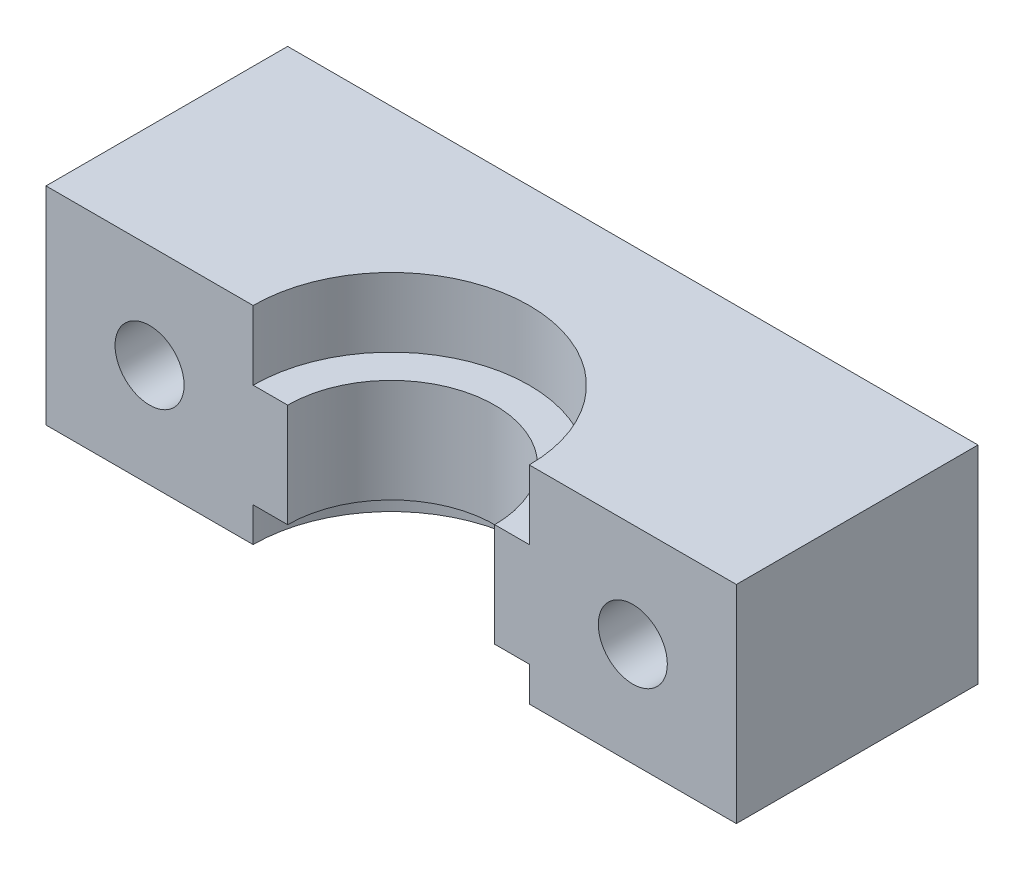
ISO-10303-21;
HEADER;
FILE_DESCRIPTION(('STEP AP214'),'2;1');
FILE_NAME('part.step','',(''),(''),'','','');
FILE_SCHEMA(('AUTOMOTIVE_DESIGN { 1 0 10303 214 1 1 1 1 }'));
ENDSEC;
DATA;
#1=APPLICATION_CONTEXT('core data for automotive mechanical design processes');
#2=APPLICATION_PROTOCOL_DEFINITION('international standard','automotive_design',2000,#1);
#3=PRODUCT_CONTEXT('',#1,'mechanical');
#4=PRODUCT('Part','Part','',(#3));
#5=PRODUCT_RELATED_PRODUCT_CATEGORY('part','',(#4));
#6=PRODUCT_DEFINITION_FORMATION('','',#4);
#7=PRODUCT_DEFINITION_CONTEXT('part definition',#1,'design');
#8=PRODUCT_DEFINITION('design','',#6,#7);
#9=PRODUCT_DEFINITION_SHAPE('','',#8);
#10=(LENGTH_UNIT() NAMED_UNIT(*) SI_UNIT(.MILLI.,.METRE.));
#11=(NAMED_UNIT(*) PLANE_ANGLE_UNIT() SI_UNIT($,.RADIAN.));
#12=(NAMED_UNIT(*) SI_UNIT($,.STERADIAN.) SOLID_ANGLE_UNIT());
#13=UNCERTAINTY_MEASURE_WITH_UNIT(LENGTH_MEASURE(1.E-05),#10,'distance_accuracy_value','');
#14=(GEOMETRIC_REPRESENTATION_CONTEXT(3) GLOBAL_UNCERTAINTY_ASSIGNED_CONTEXT((#13)) GLOBAL_UNIT_ASSIGNED_CONTEXT((#10,
#11,#12)) REPRESENTATION_CONTEXT('',''));
#15=CARTESIAN_POINT('',(0.,0.,0.));
#16=DIRECTION('',(0.,0.,1.));
#17=DIRECTION('',(1.,0.,0.));
#18=AXIS2_PLACEMENT_3D('',#15,#16,#17);
#19=CARTESIAN_POINT('',(0.,0.,14.));
#20=DIRECTION('',(0.,0.,-1.));
#21=DIRECTION('',(-1.,0.,0.));
#22=AXIS2_PLACEMENT_3D('',#19,#20,#21);
#23=PLANE('',#22);
#24=CARTESIAN_POINT('',(13.1195500030164,16.407464024797,14.));
#25=DIRECTION('',(0.,0.,1.));
#26=DIRECTION('',(1.,0.,0.));
#27=AXIS2_PLACEMENT_3D('',#24,#25,#26);
#28=CIRCLE('',#27,2.00000000000053);
#29=CARTESIAN_POINT('',(15.1195500030169,16.407464024797,14.));
#30=VERTEX_POINT('',#29);
#31=EDGE_CURVE('E145',#30,#30,#28,.T.);
#32=ORIENTED_EDGE('',*,*,#31,.F.);
#33=EDGE_LOOP('',(#32));
#34=FACE_BOUND('',#33,.T.);
#35=DIRECTION('',(0.,1.,0.));
#36=VECTOR('',#35,1.);
#37=CARTESIAN_POINT('',(19.1195500030164,22.407464024797,14.));
#38=LINE('',#37,#36);
#39=CARTESIAN_POINT('',(19.1195500030164,22.407464024797,14.));
#40=VERTEX_POINT('',#39);
#41=CARTESIAN_POINT('',(19.1195500030164,18.407464024797,14.));
#42=VERTEX_POINT('',#41);
#43=EDGE_CURVE('E122',#40,#42,#38,.F.);
#44=ORIENTED_EDGE('',*,*,#43,.F.);
#45=DIRECTION('',(-1.,0.,0.));
#46=VECTOR('',#45,1.);
#47=CARTESIAN_POINT('',(7.1195500030164,22.407464024797,14.));
#48=LINE('',#47,#46);
#49=CARTESIAN_POINT('',(7.1195500030164,22.407464024797,14.));
#50=VERTEX_POINT('',#49);
#51=EDGE_CURVE('E58',#40,#50,#48,.T.);
#52=ORIENTED_EDGE('',*,*,#51,.T.);
#53=DIRECTION('',(0.,-1.,0.));
#54=VECTOR('',#53,1.);
#55=CARTESIAN_POINT('',(7.1195500030164,10.407464024797,14.));
#56=LINE('',#55,#54);
#57=CARTESIAN_POINT('',(7.1195500030164,10.407464024797,14.));
#58=VERTEX_POINT('',#57);
#59=EDGE_CURVE('E150',#50,#58,#56,.T.);
#60=ORIENTED_EDGE('',*,*,#59,.T.);
#61=DIRECTION('',(1.,0.,0.));
#62=VECTOR('',#61,1.);
#63=CARTESIAN_POINT('',(7.1195500030164,10.407464024797,14.));
#64=LINE('',#63,#62);
#65=CARTESIAN_POINT('',(19.1195500030164,10.407464024797,14.));
#66=VERTEX_POINT('',#65);
#67=EDGE_CURVE('E88',#58,#66,#64,.T.);
#68=ORIENTED_EDGE('',*,*,#67,.T.);
#69=DIRECTION('',(0.,1.,0.));
#70=VECTOR('',#69,1.);
#71=CARTESIAN_POINT('',(19.1195500030164,22.407464024797,14.));
#72=LINE('',#71,#70);
#73=CARTESIAN_POINT('',(19.1195500030164,12.407464024797,14.));
#74=VERTEX_POINT('',#73);
#75=EDGE_CURVE('E191',#74,#66,#72,.F.);
#76=ORIENTED_EDGE('',*,*,#75,.F.);
#77=DIRECTION('',(-1.,0.,0.));
#78=VECTOR('',#77,1.);
#79=CARTESIAN_POINT('',(0.,12.407464024797,14.));
#80=LINE('',#79,#78);
#81=CARTESIAN_POINT('',(21.1195500030164,12.407464024797,14.));
#82=VERTEX_POINT('',#81);
#83=EDGE_CURVE('E170',#82,#74,#80,.T.);
#84=ORIENTED_EDGE('',*,*,#83,.F.);
#85=DIRECTION('',(0.,1.,0.));
#86=VECTOR('',#85,1.);
#87=CARTESIAN_POINT('',(21.1195500030164,22.407464024797,14.));
#88=LINE('',#87,#86);
#89=CARTESIAN_POINT('',(21.1195500030164,18.407464024797,14.));
#90=VERTEX_POINT('',#89);
#91=EDGE_CURVE('E37',#90,#82,#88,.F.);
#92=ORIENTED_EDGE('',*,*,#91,.F.);
#93=DIRECTION('',(1.,0.,0.));
#94=VECTOR('',#93,1.);
#95=CARTESIAN_POINT('',(0.,18.407464024797,14.));
#96=LINE('',#95,#94);
#97=EDGE_CURVE('E11',#42,#90,#96,.T.);
#98=ORIENTED_EDGE('',*,*,#97,.F.);
#99=EDGE_LOOP('',(#44,#52,#60,#68,#76,#84,#92,#98));
#100=FACE_BOUND('',#99,.T.);
#101=ADVANCED_FACE('F33',(#34,#100),#23,.F.);
#102=CARTESIAN_POINT('',(41.1195500030164,16.407464024797,14.));
#103=DIRECTION('',(0.,0.,1.));
#104=DIRECTION('',(1.,0.,0.));
#105=AXIS2_PLACEMENT_3D('',#102,#103,#104);
#106=CIRCLE('',#105,2.00000000000053);
#107=CARTESIAN_POINT('',(43.1195500030169,16.407464024797,14.));
#108=VERTEX_POINT('',#107);
#109=EDGE_CURVE('E167',#108,#108,#106,.T.);
#110=ORIENTED_EDGE('',*,*,#109,.F.);
#111=EDGE_LOOP('',(#110));
#112=FACE_BOUND('',#111,.T.);
#113=DIRECTION('',(0.,1.,0.));
#114=VECTOR('',#113,1.);
#115=CARTESIAN_POINT('',(35.1195500030164,22.407464024797,14.));
#116=LINE('',#115,#114);
#117=CARTESIAN_POINT('',(35.1195500030164,18.407464024797,14.));
#118=VERTEX_POINT('',#117);
#119=CARTESIAN_POINT('',(35.1195500030164,22.407464024797,14.));
#120=VERTEX_POINT('',#119);
#121=EDGE_CURVE('E49',#118,#120,#116,.T.);
#122=ORIENTED_EDGE('',*,*,#121,.F.);
#123=CARTESIAN_POINT('',(33.1195500030164,18.407464024797,14.));
#124=VERTEX_POINT('',#123);
#125=EDGE_CURVE('E42',#124,#118,#96,.T.);
#126=ORIENTED_EDGE('',*,*,#125,.F.);
#127=DIRECTION('',(0.,1.,0.));
#128=VECTOR('',#127,1.);
#129=CARTESIAN_POINT('',(33.1195500030164,22.407464024797,14.));
#130=LINE('',#129,#128);
#131=CARTESIAN_POINT('',(33.1195500030164,12.407464024797,14.));
#132=VERTEX_POINT('',#131);
#133=EDGE_CURVE('E169',#132,#124,#130,.T.);
#134=ORIENTED_EDGE('',*,*,#133,.F.);
#135=CARTESIAN_POINT('',(35.1195500030164,12.407464024797,14.));
#136=VERTEX_POINT('',#135);
#137=EDGE_CURVE('E159',#136,#132,#80,.T.);
#138=ORIENTED_EDGE('',*,*,#137,.F.);
#139=DIRECTION('',(0.,1.,0.));
#140=VECTOR('',#139,1.);
#141=CARTESIAN_POINT('',(35.1195500030164,22.407464024797,14.));
#142=LINE('',#141,#140);
#143=CARTESIAN_POINT('',(35.1195500030164,10.407464024797,14.));
#144=VERTEX_POINT('',#143);
#145=EDGE_CURVE('E130',#144,#136,#142,.T.);
#146=ORIENTED_EDGE('',*,*,#145,.F.);
#147=CARTESIAN_POINT('',(47.1195500030164,10.407464024797,14.));
#148=VERTEX_POINT('',#147);
#149=EDGE_CURVE('E211',#144,#148,#64,.T.);
#150=ORIENTED_EDGE('',*,*,#149,.T.);
#151=DIRECTION('',(0.,1.,0.));
#152=VECTOR('',#151,1.);
#153=CARTESIAN_POINT('',(47.1195500030164,10.407464024797,14.));
#154=LINE('',#153,#152);
#155=CARTESIAN_POINT('',(47.1195500030164,22.407464024797,14.));
#156=VERTEX_POINT('',#155);
#157=EDGE_CURVE('E136',#148,#156,#154,.T.);
#158=ORIENTED_EDGE('',*,*,#157,.T.);
#159=EDGE_CURVE('E135',#156,#120,#48,.T.);
#160=ORIENTED_EDGE('',*,*,#159,.T.);
#161=EDGE_LOOP('',(#122,#126,#134,#138,#146,#150,#158,#160));
#162=FACE_BOUND('',#161,.T.);
#163=ADVANCED_FACE('F216',(#112,#162),#23,.F.);
#164=CARTESIAN_POINT('',(0.,0.,0.));
#165=DIRECTION('',(0.,0.,-1.));
#166=DIRECTION('',(-1.,0.,0.));
#167=AXIS2_PLACEMENT_3D('',#164,#165,#166);
#168=PLANE('',#167);
#169=CARTESIAN_POINT('',(13.1195500030164,16.407464024797,0.));
#170=DIRECTION('',(0.,0.,1.));
#171=DIRECTION('',(1.,0.,0.));
#172=AXIS2_PLACEMENT_3D('',#169,#170,#171);
#173=CIRCLE('',#172,3.5);
#174=CARTESIAN_POINT('',(16.6195500030164,16.407464024797,0.));
#175=VERTEX_POINT('',#174);
#176=EDGE_CURVE('E202',#175,#175,#173,.T.);
#177=ORIENTED_EDGE('',*,*,#176,.T.);
#178=EDGE_LOOP('',(#177));
#179=FACE_BOUND('',#178,.T.);
#180=CARTESIAN_POINT('',(41.1195500030164,16.407464024797,0.));
#181=DIRECTION('',(0.,0.,1.));
#182=DIRECTION('',(1.,0.,0.));
#183=AXIS2_PLACEMENT_3D('',#180,#181,#182);
#184=CIRCLE('',#183,3.5);
#185=CARTESIAN_POINT('',(44.6195500030164,16.407464024797,0.));
#186=VERTEX_POINT('',#185);
#187=EDGE_CURVE('E193',#186,#186,#184,.T.);
#188=ORIENTED_EDGE('',*,*,#187,.T.);
#189=EDGE_LOOP('',(#188));
#190=FACE_BOUND('',#189,.T.);
#191=DIRECTION('',(0.,-1.,0.));
#192=VECTOR('',#191,1.);
#193=CARTESIAN_POINT('',(7.1195500030164,10.407464024797,0.));
#194=LINE('',#193,#192);
#195=CARTESIAN_POINT('',(7.1195500030164,22.407464024797,0.));
#196=VERTEX_POINT('',#195);
#197=CARTESIAN_POINT('',(7.1195500030164,10.407464024797,0.));
#198=VERTEX_POINT('',#197);
#199=EDGE_CURVE('E141',#196,#198,#194,.T.);
#200=ORIENTED_EDGE('',*,*,#199,.F.);
#201=DIRECTION('',(-1.,0.,0.));
#202=VECTOR('',#201,1.);
#203=CARTESIAN_POINT('',(7.1195500030164,22.407464024797,0.));
#204=LINE('',#203,#202);
#205=CARTESIAN_POINT('',(47.1195500030164,22.407464024797,0.));
#206=VERTEX_POINT('',#205);
#207=EDGE_CURVE('E80',#206,#196,#204,.T.);
#208=ORIENTED_EDGE('',*,*,#207,.F.);
#209=DIRECTION('',(0.,1.,0.));
#210=VECTOR('',#209,1.);
#211=CARTESIAN_POINT('',(47.1195500030164,10.407464024797,0.));
#212=LINE('',#211,#210);
#213=CARTESIAN_POINT('',(47.1195500030164,10.407464024797,0.));
#214=VERTEX_POINT('',#213);
#215=EDGE_CURVE('E147',#214,#206,#212,.T.);
#216=ORIENTED_EDGE('',*,*,#215,.F.);
#217=DIRECTION('',(1.,0.,0.));
#218=VECTOR('',#217,1.);
#219=CARTESIAN_POINT('',(7.1195500030164,10.407464024797,0.));
#220=LINE('',#219,#218);
#221=EDGE_CURVE('E144',#198,#214,#220,.T.);
#222=ORIENTED_EDGE('',*,*,#221,.F.);
#223=EDGE_LOOP('',(#200,#208,#216,#222));
#224=FACE_BOUND('',#223,.T.);
#225=ADVANCED_FACE('F249',(#179,#190,#224),#168,.T.);
#226=CARTESIAN_POINT('',(7.1195500030164,10.407464024797,14.));
#227=DIRECTION('',(1.,0.,0.));
#228=DIRECTION('',(0.,0.,-1.));
#229=AXIS2_PLACEMENT_3D('',#226,#227,#228);
#230=PLANE('',#229);
#231=ORIENTED_EDGE('',*,*,#199,.T.);
#232=DIRECTION('',(0.,0.,-1.));
#233=VECTOR('',#232,1.);
#234=CARTESIAN_POINT('',(7.1195500030164,10.407464024797,14.));
#235=LINE('',#234,#233);
#236=EDGE_CURVE('E157',#58,#198,#235,.T.);
#237=ORIENTED_EDGE('',*,*,#236,.F.);
#238=ORIENTED_EDGE('',*,*,#59,.F.);
#239=DIRECTION('',(0.,0.,-1.));
#240=VECTOR('',#239,1.);
#241=CARTESIAN_POINT('',(7.1195500030164,22.407464024797,14.));
#242=LINE('',#241,#240);
#243=EDGE_CURVE('E133',#50,#196,#242,.T.);
#244=ORIENTED_EDGE('',*,*,#243,.T.);
#245=EDGE_LOOP('',(#231,#237,#238,#244));
#246=FACE_BOUND('',#245,.T.);
#247=ADVANCED_FACE('F35',(#246),#230,.F.);
#248=CARTESIAN_POINT('',(7.1195500030164,10.407464024797,14.));
#249=DIRECTION('',(0.,1.,0.));
#250=DIRECTION('',(-1.,0.,0.));
#251=AXIS2_PLACEMENT_3D('',#248,#249,#250);
#252=PLANE('',#251);
#253=CARTESIAN_POINT('',(27.1195500030164,10.407464024797,14.));
#254=DIRECTION('',(0.,1.,0.));
#255=DIRECTION('',(0.,0.,1.));
#256=AXIS2_PLACEMENT_3D('',#253,#254,#255);
#257=CIRCLE('',#256,8.);
#258=EDGE_CURVE('E228',#144,#66,#257,.T.);
#259=ORIENTED_EDGE('',*,*,#258,.T.);
#260=ORIENTED_EDGE('',*,*,#67,.F.);
#261=ORIENTED_EDGE('',*,*,#236,.T.);
#262=ORIENTED_EDGE('',*,*,#221,.T.);
#263=DIRECTION('',(0.,0.,-1.));
#264=VECTOR('',#263,1.);
#265=CARTESIAN_POINT('',(47.1195500030164,10.407464024797,14.));
#266=LINE('',#265,#264);
#267=EDGE_CURVE('E154',#148,#214,#266,.T.);
#268=ORIENTED_EDGE('',*,*,#267,.F.);
#269=ORIENTED_EDGE('',*,*,#149,.F.);
#270=EDGE_LOOP('',(#259,#260,#261,#262,#268,#269));
#271=FACE_BOUND('',#270,.T.);
#272=ADVANCED_FACE('F219',(#271),#252,.F.);
#273=CARTESIAN_POINT('',(47.1195500030164,10.407464024797,14.));
#274=DIRECTION('',(-1.,0.,0.));
#275=DIRECTION('',(0.,0.,1.));
#276=AXIS2_PLACEMENT_3D('',#273,#274,#275);
#277=PLANE('',#276);
#278=ORIENTED_EDGE('',*,*,#215,.T.);
#279=DIRECTION('',(0.,0.,-1.));
#280=VECTOR('',#279,1.);
#281=CARTESIAN_POINT('',(47.1195500030164,22.407464024797,14.));
#282=LINE('',#281,#280);
#283=EDGE_CURVE('E152',#156,#206,#282,.T.);
#284=ORIENTED_EDGE('',*,*,#283,.F.);
#285=ORIENTED_EDGE('',*,*,#157,.F.);
#286=ORIENTED_EDGE('',*,*,#267,.T.);
#287=EDGE_LOOP('',(#278,#284,#285,#286));
#288=FACE_BOUND('',#287,.T.);
#289=ADVANCED_FACE('F222',(#288),#277,.F.);
#290=CARTESIAN_POINT('',(7.1195500030164,22.407464024797,14.));
#291=DIRECTION('',(0.,-1.,0.));
#292=DIRECTION('',(1.,0.,0.));
#293=AXIS2_PLACEMENT_3D('',#290,#291,#292);
#294=PLANE('',#293);
#295=CARTESIAN_POINT('',(27.1195500030164,22.407464024797,14.));
#296=DIRECTION('',(0.,1.,0.));
#297=DIRECTION('',(0.,0.,1.));
#298=AXIS2_PLACEMENT_3D('',#295,#296,#297);
#299=CIRCLE('',#298,8.);
#300=EDGE_CURVE('E120',#120,#40,#299,.T.);
#301=ORIENTED_EDGE('',*,*,#300,.F.);
#302=ORIENTED_EDGE('',*,*,#159,.F.);
#303=ORIENTED_EDGE('',*,*,#283,.T.);
#304=ORIENTED_EDGE('',*,*,#207,.T.);
#305=ORIENTED_EDGE('',*,*,#243,.F.);
#306=ORIENTED_EDGE('',*,*,#51,.F.);
#307=EDGE_LOOP('',(#301,#302,#303,#304,#305,#306));
#308=FACE_BOUND('',#307,.T.);
#309=ADVANCED_FACE('F132',(#308),#294,.F.);
#310=CARTESIAN_POINT('',(13.1195500030164,16.407464024797,14.));
#311=DIRECTION('',(0.,0.,-1.));
#312=DIRECTION('',(-1.,0.,0.));
#313=AXIS2_PLACEMENT_3D('',#310,#311,#312);
#314=CYLINDRICAL_SURFACE('',#313,2.00000000000053);
#315=CARTESIAN_POINT('',(13.1195500030164,16.407464024797,5.));
#316=DIRECTION('',(0.,0.,1.));
#317=DIRECTION('',(1.,0.,0.));
#318=AXIS2_PLACEMENT_3D('',#315,#316,#317);
#319=CIRCLE('',#318,2.00000000000053);
#320=CARTESIAN_POINT('',(15.1195500030169,16.407464024797,5.));
#321=VERTEX_POINT('',#320);
#322=EDGE_CURVE('E163',#321,#321,#319,.T.);
#323=ORIENTED_EDGE('',*,*,#322,.F.);
#324=EDGE_LOOP('',(#323));
#325=FACE_BOUND('',#324,.T.);
#326=ORIENTED_EDGE('',*,*,#31,.T.);
#327=EDGE_LOOP('',(#326));
#328=FACE_BOUND('',#327,.T.);
#329=ADVANCED_FACE('F254',(#325,#328),#314,.F.);
#330=CARTESIAN_POINT('',(41.1195500030164,16.407464024797,14.));
#331=DIRECTION('',(0.,0.,-1.));
#332=DIRECTION('',(-1.,0.,0.));
#333=AXIS2_PLACEMENT_3D('',#330,#331,#332);
#334=CYLINDRICAL_SURFACE('',#333,2.00000000000053);
#335=CARTESIAN_POINT('',(41.1195500030164,16.407464024797,5.));
#336=DIRECTION('',(0.,0.,1.));
#337=DIRECTION('',(1.,0.,0.));
#338=AXIS2_PLACEMENT_3D('',#335,#336,#337);
#339=CIRCLE('',#338,2.00000000000053);
#340=CARTESIAN_POINT('',(43.1195500030169,16.407464024797,5.));
#341=VERTEX_POINT('',#340);
#342=EDGE_CURVE('E160',#341,#341,#339,.T.);
#343=ORIENTED_EDGE('',*,*,#342,.F.);
#344=EDGE_LOOP('',(#343));
#345=FACE_BOUND('',#344,.T.);
#346=ORIENTED_EDGE('',*,*,#109,.T.);
#347=EDGE_LOOP('',(#346));
#348=FACE_BOUND('',#347,.T.);
#349=ADVANCED_FACE('F346',(#345,#348),#334,.F.);
#350=CARTESIAN_POINT('',(41.1195500030164,16.407464024797,5.));
#351=DIRECTION('',(0.,0.,-1.));
#352=DIRECTION('',(-1.,0.,0.));
#353=AXIS2_PLACEMENT_3D('',#350,#351,#352);
#354=CYLINDRICAL_SURFACE('',#353,3.5);
#355=CARTESIAN_POINT('',(41.1195500030164,16.407464024797,5.));
#356=DIRECTION('',(0.,0.,1.));
#357=DIRECTION('',(1.,0.,0.));
#358=AXIS2_PLACEMENT_3D('',#355,#356,#357);
#359=CIRCLE('',#358,3.5);
#360=CARTESIAN_POINT('',(44.6195500030164,16.407464024797,5.));
#361=VERTEX_POINT('',#360);
#362=EDGE_CURVE('E196',#361,#361,#359,.T.);
#363=ORIENTED_EDGE('',*,*,#362,.T.);
#364=EDGE_LOOP('',(#363));
#365=FACE_BOUND('',#364,.T.);
#366=ORIENTED_EDGE('',*,*,#187,.F.);
#367=EDGE_LOOP('',(#366));
#368=FACE_BOUND('',#367,.T.);
#369=ADVANCED_FACE('F343',(#365,#368),#354,.F.);
#370=CARTESIAN_POINT('',(41.1195500030164,16.407464024797,5.));
#371=DIRECTION('',(0.,0.,1.));
#372=DIRECTION('',(1.,0.,0.));
#373=AXIS2_PLACEMENT_3D('',#370,#371,#372);
#374=PLANE('',#373);
#375=ORIENTED_EDGE('',*,*,#342,.T.);
#376=EDGE_LOOP('',(#375));
#377=FACE_BOUND('',#376,.T.);
#378=ORIENTED_EDGE('',*,*,#362,.F.);
#379=EDGE_LOOP('',(#378));
#380=FACE_BOUND('',#379,.T.);
#381=ADVANCED_FACE('F339',(#377,#380),#374,.F.);
#382=CARTESIAN_POINT('',(13.1195500030164,16.407464024797,5.));
#383=DIRECTION('',(0.,0.,-1.));
#384=DIRECTION('',(-1.,0.,0.));
#385=AXIS2_PLACEMENT_3D('',#382,#383,#384);
#386=CYLINDRICAL_SURFACE('',#385,3.5);
#387=CARTESIAN_POINT('',(13.1195500030164,16.407464024797,5.));
#388=DIRECTION('',(0.,0.,1.));
#389=DIRECTION('',(1.,0.,0.));
#390=AXIS2_PLACEMENT_3D('',#387,#388,#389);
#391=CIRCLE('',#390,3.5);
#392=CARTESIAN_POINT('',(16.6195500030164,16.407464024797,5.));
#393=VERTEX_POINT('',#392);
#394=EDGE_CURVE('E164',#393,#393,#391,.T.);
#395=ORIENTED_EDGE('',*,*,#394,.T.);
#396=EDGE_LOOP('',(#395));
#397=FACE_BOUND('',#396,.T.);
#398=ORIENTED_EDGE('',*,*,#176,.F.);
#399=EDGE_LOOP('',(#398));
#400=FACE_BOUND('',#399,.T.);
#401=ADVANCED_FACE('F239',(#397,#400),#386,.F.);
#402=CARTESIAN_POINT('',(13.1195500030164,16.407464024797,5.));
#403=DIRECTION('',(0.,0.,1.));
#404=DIRECTION('',(1.,0.,0.));
#405=AXIS2_PLACEMENT_3D('',#402,#403,#404);
#406=PLANE('',#405);
#407=ORIENTED_EDGE('',*,*,#322,.T.);
#408=EDGE_LOOP('',(#407));
#409=FACE_BOUND('',#408,.T.);
#410=ORIENTED_EDGE('',*,*,#394,.F.);
#411=EDGE_LOOP('',(#410));
#412=FACE_BOUND('',#411,.T.);
#413=ADVANCED_FACE('F232',(#409,#412),#406,.F.);
#414=CARTESIAN_POINT('',(35.1195500030164,18.407464024797,14.));
#415=DIRECTION('',(0.,1.,0.));
#416=DIRECTION('',(0.,0.,1.));
#417=AXIS2_PLACEMENT_3D('',#414,#415,#416);
#418=PLANE('',#417);
#419=ORIENTED_EDGE('',*,*,#97,.T.);
#420=CARTESIAN_POINT('',(27.1195500030164,18.407464024797,14.));
#421=DIRECTION('',(0.,1.,0.));
#422=DIRECTION('',(0.,0.,1.));
#423=AXIS2_PLACEMENT_3D('',#420,#421,#422);
#424=CIRCLE('',#423,6.);
#425=EDGE_CURVE('E185',#124,#90,#424,.T.);
#426=ORIENTED_EDGE('',*,*,#425,.F.);
#427=ORIENTED_EDGE('',*,*,#125,.T.);
#428=CARTESIAN_POINT('',(27.1195500030164,18.407464024797,14.));
#429=DIRECTION('',(0.,1.,0.));
#430=DIRECTION('',(0.,0.,1.));
#431=AXIS2_PLACEMENT_3D('',#428,#429,#430);
#432=CIRCLE('',#431,8.);
#433=EDGE_CURVE('E126',#118,#42,#432,.T.);
#434=ORIENTED_EDGE('',*,*,#433,.T.);
#435=EDGE_LOOP('',(#419,#426,#427,#434));
#436=FACE_BOUND('',#435,.T.);
#437=ADVANCED_FACE('F230',(#436),#418,.T.);
#438=CARTESIAN_POINT('',(27.1195500030164,22.407464024797,14.));
#439=DIRECTION('',(0.,1.,0.));
#440=DIRECTION('',(0.,0.,1.));
#441=AXIS2_PLACEMENT_3D('',#438,#439,#440);
#442=CYLINDRICAL_SURFACE('',#441,6.);
#443=ORIENTED_EDGE('',*,*,#91,.T.);
#444=CARTESIAN_POINT('',(27.1195500030164,12.407464024797,14.));
#445=DIRECTION('',(0.,1.,0.));
#446=DIRECTION('',(0.,0.,1.));
#447=AXIS2_PLACEMENT_3D('',#444,#445,#446);
#448=CIRCLE('',#447,6.);
#449=EDGE_CURVE('E183',#132,#82,#448,.T.);
#450=ORIENTED_EDGE('',*,*,#449,.F.);
#451=ORIENTED_EDGE('',*,*,#133,.T.);
#452=ORIENTED_EDGE('',*,*,#425,.T.);
#453=EDGE_LOOP('',(#443,#450,#451,#452));
#454=FACE_BOUND('',#453,.T.);
#455=ADVANCED_FACE('F182',(#454),#442,.F.);
#456=CARTESIAN_POINT('',(33.1195500030164,12.407464024797,14.));
#457=DIRECTION('',(0.,-1.,0.));
#458=DIRECTION('',(0.,0.,-1.));
#459=AXIS2_PLACEMENT_3D('',#456,#457,#458);
#460=PLANE('',#459);
#461=ORIENTED_EDGE('',*,*,#137,.T.);
#462=ORIENTED_EDGE('',*,*,#449,.T.);
#463=ORIENTED_EDGE('',*,*,#83,.T.);
#464=CARTESIAN_POINT('',(27.1195500030164,12.407464024797,14.));
#465=DIRECTION('',(0.,1.,0.));
#466=DIRECTION('',(0.,0.,1.));
#467=AXIS2_PLACEMENT_3D('',#464,#465,#466);
#468=CIRCLE('',#467,8.);
#469=EDGE_CURVE('E188',#136,#74,#468,.T.);
#470=ORIENTED_EDGE('',*,*,#469,.F.);
#471=EDGE_LOOP('',(#461,#462,#463,#470));
#472=FACE_BOUND('',#471,.T.);
#473=ADVANCED_FACE('F186',(#472),#460,.T.);
#474=CARTESIAN_POINT('',(27.1195500030164,22.407464024797,14.));
#475=DIRECTION('',(0.,1.,0.));
#476=DIRECTION('',(0.,0.,1.));
#477=AXIS2_PLACEMENT_3D('',#474,#475,#476);
#478=CYLINDRICAL_SURFACE('',#477,8.);
#479=ORIENTED_EDGE('',*,*,#75,.T.);
#480=ORIENTED_EDGE('',*,*,#258,.F.);
#481=ORIENTED_EDGE('',*,*,#145,.T.);
#482=ORIENTED_EDGE('',*,*,#469,.T.);
#483=EDGE_LOOP('',(#479,#480,#481,#482));
#484=FACE_BOUND('',#483,.T.);
#485=ADVANCED_FACE('F229',(#484),#478,.F.);
#486=CARTESIAN_POINT('',(27.1195500030164,22.407464024797,14.));
#487=DIRECTION('',(0.,1.,0.));
#488=DIRECTION('',(0.,0.,1.));
#489=AXIS2_PLACEMENT_3D('',#486,#487,#488);
#490=CYLINDRICAL_SURFACE('',#489,8.);
#491=ORIENTED_EDGE('',*,*,#43,.T.);
#492=ORIENTED_EDGE('',*,*,#433,.F.);
#493=ORIENTED_EDGE('',*,*,#121,.T.);
#494=ORIENTED_EDGE('',*,*,#300,.T.);
#495=EDGE_LOOP('',(#491,#492,#493,#494));
#496=FACE_BOUND('',#495,.T.);
#497=ADVANCED_FACE('F121',(#496),#490,.F.);
#498=CLOSED_SHELL('',(#101,#163,#225,#247,#272,#289,#309,#329,#349,#369,#381,#401,#413,#437,
#455,#473,#485,#497));
#499=MANIFOLD_SOLID_BREP('B2',#498);
#500=ADVANCED_BREP_SHAPE_REPRESENTATION('',(#18,#499),#14);
#501=SHAPE_DEFINITION_REPRESENTATION(#9,#500);
ENDSEC;
END-ISO-10303-21;
